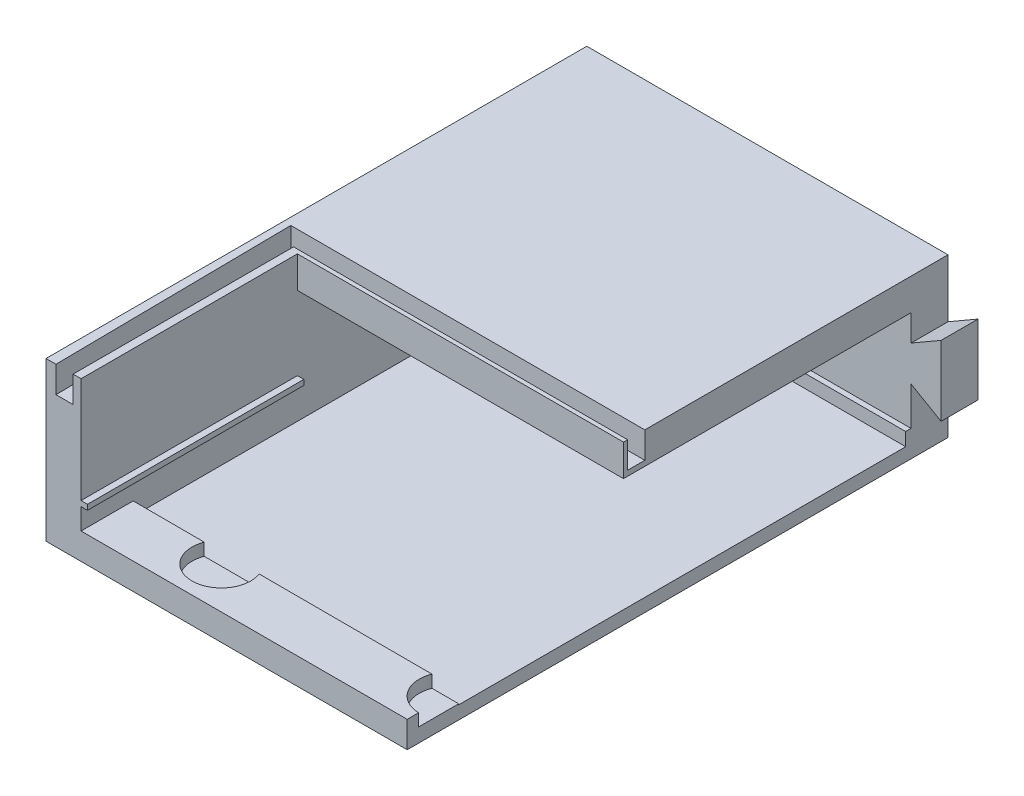
ISO-10303-21;
HEADER;
FILE_DESCRIPTION(('STEP AP214'),'2;1');
FILE_NAME('part.step','',(''),(''),'','','');
FILE_SCHEMA(('AUTOMOTIVE_DESIGN { 1 0 10303 214 1 1 1 1 }'));
ENDSEC;
DATA;
#1=APPLICATION_CONTEXT('core data for automotive mechanical design processes');
#2=APPLICATION_PROTOCOL_DEFINITION('international standard','automotive_design',2000,#1);
#3=PRODUCT_CONTEXT('',#1,'mechanical');
#4=PRODUCT('Part','Part','',(#3));
#5=PRODUCT_RELATED_PRODUCT_CATEGORY('part','',(#4));
#6=PRODUCT_DEFINITION_FORMATION('','',#4);
#7=PRODUCT_DEFINITION_CONTEXT('part definition',#1,'design');
#8=PRODUCT_DEFINITION('design','',#6,#7);
#9=PRODUCT_DEFINITION_SHAPE('','',#8);
#10=(LENGTH_UNIT() NAMED_UNIT(*) SI_UNIT(.MILLI.,.METRE.));
#11=(NAMED_UNIT(*) PLANE_ANGLE_UNIT() SI_UNIT($,.RADIAN.));
#12=(NAMED_UNIT(*) SI_UNIT($,.STERADIAN.) SOLID_ANGLE_UNIT());
#13=UNCERTAINTY_MEASURE_WITH_UNIT(LENGTH_MEASURE(1.E-05),#10,'distance_accuracy_value','');
#14=(GEOMETRIC_REPRESENTATION_CONTEXT(3) GLOBAL_UNCERTAINTY_ASSIGNED_CONTEXT((#13)) GLOBAL_UNIT_ASSIGNED_CONTEXT((#10,
#11,#12)) REPRESENTATION_CONTEXT('',''));
#15=CARTESIAN_POINT('',(0.,0.,0.));
#16=DIRECTION('',(0.,0.,1.));
#17=DIRECTION('',(1.,0.,0.));
#18=AXIS2_PLACEMENT_3D('',#15,#16,#17);
#19=CARTESIAN_POINT('',(-5.2976725084512,60.,90.));
#20=DIRECTION('',(-1.,0.,0.));
#21=DIRECTION('',(0.,0.,1.));
#22=AXIS2_PLACEMENT_3D('',#19,#20,#21);
#23=PLANE('',#22);
#24=DIRECTION('',(0.,0.,-1.));
#25=VECTOR('',#24,1.);
#26=CARTESIAN_POINT('',(-5.2976725084512,0.,90.));
#27=LINE('',#26,#25);
#28=CARTESIAN_POINT('',(-5.2976725084512,0.,90.));
#29=VERTEX_POINT('',#28);
#30=CARTESIAN_POINT('',(-5.2976725084512,0.,-115.));
#31=VERTEX_POINT('',#30);
#32=EDGE_CURVE('E303',#29,#31,#27,.T.);
#33=ORIENTED_EDGE('',*,*,#32,.F.);
#34=DIRECTION('',(0.,-1.,0.));
#35=VECTOR('',#34,1.);
#36=CARTESIAN_POINT('',(-5.2976725084512,60.,90.));
#37=LINE('',#36,#35);
#38=CARTESIAN_POINT('',(-5.2976725084512,60.,90.));
#39=VERTEX_POINT('',#38);
#40=EDGE_CURVE('E294',#39,#29,#37,.T.);
#41=ORIENTED_EDGE('',*,*,#40,.F.);
#42=DIRECTION('',(0.,0.,-1.));
#43=VECTOR('',#42,1.);
#44=CARTESIAN_POINT('',(-5.2976725084512,60.,90.));
#45=LINE('',#44,#43);
#46=CARTESIAN_POINT('',(-5.2976725084512,60.,-115.));
#47=VERTEX_POINT('',#46);
#48=EDGE_CURVE('E293',#39,#47,#45,.T.);
#49=ORIENTED_EDGE('',*,*,#48,.T.);
#50=DIRECTION('',(0.,-1.,0.));
#51=VECTOR('',#50,1.);
#52=CARTESIAN_POINT('',(-5.2976725084512,60.,-115.));
#53=LINE('',#52,#51);
#54=EDGE_CURVE('E816',#47,#31,#53,.T.);
#55=ORIENTED_EDGE('',*,*,#54,.T.);
#56=EDGE_LOOP('',(#33,#41,#49,#55));
#57=FACE_BOUND('',#56,.T.);
#58=ADVANCED_FACE('F45',(#57),#23,.T.);
#59=CARTESIAN_POINT('',(0.,0.,8.));
#60=DIRECTION('',(0.,0.,1.));
#61=DIRECTION('',(1.,0.,0.));
#62=AXIS2_PLACEMENT_3D('',#59,#60,#61);
#63=PLANE('',#62);
#64=DIRECTION('',(1.,0.,0.));
#65=VECTOR('',#64,1.);
#66=CARTESIAN_POINT('',(255.25,20.,8.));
#67=LINE('',#66,#65);
#68=CARTESIAN_POINT('',(8.00000000000001,20.,8.));
#69=VERTEX_POINT('',#68);
#70=CARTESIAN_POINT('',(10.4282385352864,20.,8.));
#71=VERTEX_POINT('',#70);
#72=EDGE_CURVE('E771',#69,#71,#67,.T.);
#73=ORIENTED_EDGE('',*,*,#72,.T.);
#74=DIRECTION('',(0.,-1.,0.));
#75=VECTOR('',#74,1.);
#76=CARTESIAN_POINT('',(10.4282385352864,9.99999999999999,8.));
#77=LINE('',#76,#75);
#78=CARTESIAN_POINT('',(10.4282385352864,18.,8.));
#79=VERTEX_POINT('',#78);
#80=EDGE_CURVE('E387',#71,#79,#77,.T.);
#81=ORIENTED_EDGE('',*,*,#80,.T.);
#82=DIRECTION('',(-1.,0.,0.));
#83=VECTOR('',#82,1.);
#84=CARTESIAN_POINT('',(255.25,18.,8.));
#85=LINE('',#84,#83);
#86=CARTESIAN_POINT('',(8.00000000000001,18.,8.));
#87=VERTEX_POINT('',#86);
#88=EDGE_CURVE('E88',#79,#87,#85,.T.);
#89=ORIENTED_EDGE('',*,*,#88,.T.);
#90=DIRECTION('',(0.,-1.,0.));
#91=VECTOR('',#90,1.);
#92=CARTESIAN_POINT('',(8.00000000000001,48.,8.));
#93=LINE('',#92,#91);
#94=EDGE_CURVE('E83',#69,#87,#93,.T.);
#95=ORIENTED_EDGE('',*,*,#94,.F.);
#96=EDGE_LOOP('',(#73,#81,#89,#95));
#97=FACE_BOUND('',#96,.T.);
#98=ADVANCED_FACE('F526',(#97),#63,.F.);
#99=CARTESIAN_POINT('',(131.857766280656,5.33999999999999,74.522104321755));
#100=DIRECTION('',(0.,1.,0.));
#101=DIRECTION('',(0.,0.,1.));
#102=AXIS2_PLACEMENT_3D('',#99,#100,#101);
#103=PLANE('',#102);
#104=CARTESIAN_POINT('',(131.857766280656,5.33999999999999,74.522104321755));
#105=DIRECTION('',(0.,1.,0.));
#106=DIRECTION('',(0.,0.,1.));
#107=AXIS2_PLACEMENT_3D('',#104,#105,#106);
#108=CIRCLE('',#107,11.15);
#109=CARTESIAN_POINT('',(121.471660690305,5.33999999999999,70.4660827899976));
#110=VERTEX_POINT('',#109);
#111=CARTESIAN_POINT('',(131.625,5.33999999999999,85.6696744542363));
#112=VERTEX_POINT('',#111);
#113=EDGE_CURVE('E335',#110,#112,#108,.T.);
#114=ORIENTED_EDGE('',*,*,#113,.T.);
#115=DIRECTION('',(0.,0.,-1.));
#116=VECTOR('',#115,1.);
#117=CARTESIAN_POINT('',(131.625,5.33999999999999,74.522104321755));
#118=LINE('',#117,#116);
#119=CARTESIAN_POINT('',(131.625,5.33999999999999,70.485148128343));
#120=VERTEX_POINT('',#119);
#121=EDGE_CURVE('E404',#112,#120,#118,.T.);
#122=ORIENTED_EDGE('',*,*,#121,.T.);
#123=DIRECTION('',(0.999998237049616,0.,0.00187773737807381));
#124=VECTOR('',#123,1.);
#125=CARTESIAN_POINT('',(131.86534579012,5.33999999999999,70.4855994354124));
#126=LINE('',#125,#124);
#127=EDGE_CURVE('E344',#110,#120,#126,.T.);
#128=ORIENTED_EDGE('',*,*,#127,.F.);
#129=EDGE_LOOP('',(#114,#122,#128));
#130=FACE_BOUND('',#129,.T.);
#131=ADVANCED_FACE('F484',(#130),#103,.T.);
#132=CARTESIAN_POINT('',(131.857766280656,5.33999999999999,74.522104321755));
#133=DIRECTION('',(0.,1.,0.));
#134=DIRECTION('',(0.,0.,1.));
#135=AXIS2_PLACEMENT_3D('',#132,#133,#134);
#136=CYLINDRICAL_SURFACE('',#135,11.15);
#137=DIRECTION('',(0.,1.,0.));
#138=VECTOR('',#137,1.);
#139=CARTESIAN_POINT('',(131.625,5.33999999999999,85.6696744542363));
#140=LINE('',#139,#138);
#141=CARTESIAN_POINT('',(131.625,9.99999999999999,85.6696744542363));
#142=VERTEX_POINT('',#141);
#143=EDGE_CURVE('E453',#112,#142,#140,.T.);
#144=ORIENTED_EDGE('',*,*,#143,.F.);
#145=ORIENTED_EDGE('',*,*,#113,.F.);
#146=DIRECTION('',(0.,1.,0.));
#147=VECTOR('',#146,1.);
#148=CARTESIAN_POINT('',(121.471660690305,5.33999999999999,70.4660827899976));
#149=LINE('',#148,#147);
#150=CARTESIAN_POINT('',(121.471660690305,9.99999999999999,70.4660827899976));
#151=VERTEX_POINT('',#150);
#152=EDGE_CURVE('E348',#110,#151,#149,.T.);
#153=ORIENTED_EDGE('',*,*,#152,.T.);
#154=CARTESIAN_POINT('',(131.857766280656,9.99999999999999,74.522104321755));
#155=DIRECTION('',(0.,1.,0.));
#156=DIRECTION('',(0.,0.,1.));
#157=AXIS2_PLACEMENT_3D('',#154,#155,#156);
#158=CIRCLE('',#157,11.15);
#159=EDGE_CURVE('E340',#151,#142,#158,.T.);
#160=ORIENTED_EDGE('',*,*,#159,.T.);
#161=EDGE_LOOP('',(#144,#145,#153,#160));
#162=FACE_BOUND('',#161,.T.);
#163=ADVANCED_FACE('F487',(#162),#136,.F.);
#164=CARTESIAN_POINT('',(45.4096313441434,5.33999999999999,74.2249257103475));
#165=DIRECTION('',(0.,1.,0.));
#166=DIRECTION('',(0.,0.,1.));
#167=AXIS2_PLACEMENT_3D('',#164,#165,#166);
#168=PLANE('',#167);
#169=DIRECTION('',(0.999998237049616,0.,0.00187773737807381));
#170=VECTOR('',#169,1.);
#171=CARTESIAN_POINT('',(45.4169576384815,5.33999999999999,70.3232717795302));
#172=LINE('',#171,#170);
#173=CARTESIAN_POINT('',(34.9719033899041,5.33999999999999,70.3036586761747));
#174=VERTEX_POINT('',#173);
#175=CARTESIAN_POINT('',(55.8620118870589,5.33999999999999,70.3428848828857));
#176=VERTEX_POINT('',#175);
#177=EDGE_CURVE('E760',#174,#176,#172,.T.);
#178=ORIENTED_EDGE('',*,*,#177,.F.);
#179=CARTESIAN_POINT('',(45.4096313441434,5.33999999999999,74.2249257103475));
#180=DIRECTION('',(0.,1.,0.));
#181=DIRECTION('',(0.,0.,1.));
#182=AXIS2_PLACEMENT_3D('',#179,#180,#181);
#183=CIRCLE('',#182,11.15);
#184=EDGE_CURVE('E744',#174,#176,#183,.T.);
#185=ORIENTED_EDGE('',*,*,#184,.T.);
#186=EDGE_LOOP('',(#178,#185));
#187=FACE_BOUND('',#186,.T.);
#188=ADVANCED_FACE('F558',(#187),#168,.T.);
#189=CARTESIAN_POINT('',(45.4096313441434,5.33999999999999,74.2249257103475));
#190=DIRECTION('',(0.,1.,0.));
#191=DIRECTION('',(0.,0.,1.));
#192=AXIS2_PLACEMENT_3D('',#189,#190,#191);
#193=CYLINDRICAL_SURFACE('',#192,11.15);
#194=CARTESIAN_POINT('',(45.4096313441434,9.99999999999999,74.2249257103475));
#195=DIRECTION('',(0.,1.,0.));
#196=DIRECTION('',(0.,0.,1.));
#197=AXIS2_PLACEMENT_3D('',#194,#195,#196);
#198=CIRCLE('',#197,11.15);
#199=CARTESIAN_POINT('',(34.9719033899041,9.99999999999999,70.3036586761747));
#200=VERTEX_POINT('',#199);
#201=CARTESIAN_POINT('',(55.8620118870589,9.99999999999999,70.3428848828857));
#202=VERTEX_POINT('',#201);
#203=EDGE_CURVE('E343',#200,#202,#198,.T.);
#204=ORIENTED_EDGE('',*,*,#203,.T.);
#205=DIRECTION('',(0.,1.,0.));
#206=VECTOR('',#205,1.);
#207=CARTESIAN_POINT('',(55.8620118870589,5.33999999999999,70.3428848828857));
#208=LINE('',#207,#206);
#209=EDGE_CURVE('E347',#202,#176,#208,.F.);
#210=ORIENTED_EDGE('',*,*,#209,.T.);
#211=ORIENTED_EDGE('',*,*,#184,.F.);
#212=DIRECTION('',(0.,1.,0.));
#213=VECTOR('',#212,1.);
#214=CARTESIAN_POINT('',(34.9719033899041,5.33999999999999,70.3036586761747));
#215=LINE('',#214,#213);
#216=EDGE_CURVE('E756',#174,#200,#215,.T.);
#217=ORIENTED_EDGE('',*,*,#216,.T.);
#218=EDGE_LOOP('',(#204,#210,#211,#217));
#219=FACE_BOUND('',#218,.T.);
#220=ADVANCED_FACE('F568',(#219),#193,.F.);
#221=CARTESIAN_POINT('',(255.25,9.99999999999999,8.));
#222=DIRECTION('',(0.,0.,-1.));
#223=DIRECTION('',(-1.,0.,0.));
#224=AXIS2_PLACEMENT_3D('',#221,#222,#223);
#225=PLANE('',#224);
#226=DIRECTION('',(0.,-1.,0.));
#227=VECTOR('',#226,1.);
#228=CARTESIAN_POINT('',(131.625,9.99999999999999,8.));
#229=LINE('',#228,#227);
#230=CARTESIAN_POINT('',(131.625,60.,8.));
#231=VERTEX_POINT('',#230);
#232=CARTESIAN_POINT('',(131.625,48.,8.));
#233=VERTEX_POINT('',#232);
#234=EDGE_CURVE('E260',#231,#233,#229,.T.);
#235=ORIENTED_EDGE('',*,*,#234,.F.);
#236=DIRECTION('',(-1.,0.,0.));
#237=VECTOR('',#236,1.);
#238=CARTESIAN_POINT('',(255.25,60.,8.));
#239=LINE('',#238,#237);
#240=CARTESIAN_POINT('',(8.,60.,8.));
#241=VERTEX_POINT('',#240);
#242=EDGE_CURVE('E332',#231,#241,#239,.T.);
#243=ORIENTED_EDGE('',*,*,#242,.T.);
#244=DIRECTION('',(0.,1.,0.));
#245=VECTOR('',#244,1.);
#246=CARTESIAN_POINT('',(8.,9.99999999999999,8.));
#247=LINE('',#246,#245);
#248=CARTESIAN_POINT('',(8.00000000000001,48.,8.));
#249=VERTEX_POINT('',#248);
#250=EDGE_CURVE('E263',#249,#241,#247,.T.);
#251=ORIENTED_EDGE('',*,*,#250,.F.);
#252=DIRECTION('',(-1.,0.,0.));
#253=VECTOR('',#252,1.);
#254=CARTESIAN_POINT('',(255.25,48.,8.));
#255=LINE('',#254,#253);
#256=EDGE_CURVE('E49',#233,#249,#255,.T.);
#257=ORIENTED_EDGE('',*,*,#256,.F.);
#258=EDGE_LOOP('',(#235,#243,#251,#257));
#259=FACE_BOUND('',#258,.T.);
#260=ADVANCED_FACE('F259',(#259),#225,.F.);
#261=CARTESIAN_POINT('',(8.,4.99999999999999,70.2530124357349));
#262=DIRECTION('',(-0.00187773737807381,0.,0.999998237049616));
#263=DIRECTION('',(0.999998237049616,0.,0.00187773737807381));
#264=AXIS2_PLACEMENT_3D('',#261,#262,#263);
#265=PLANE('',#264);
#266=DIRECTION('',(0.,1.,0.));
#267=VECTOR('',#266,1.);
#268=CARTESIAN_POINT('',(131.625,5.00000000000111,70.4851481283429));
#269=LINE('',#268,#267);
#270=CARTESIAN_POINT('',(131.625,4.99999999999999,70.4851481283429));
#271=VERTEX_POINT('',#270);
#272=EDGE_CURVE('E457',#271,#120,#269,.T.);
#273=ORIENTED_EDGE('',*,*,#272,.F.);
#274=DIRECTION('',(0.999998237049615,0.,0.00187773737807381));
#275=VECTOR('',#274,1.);
#276=CARTESIAN_POINT('',(8.,4.99999999999999,70.2530124357349));
#277=LINE('',#276,#275);
#278=CARTESIAN_POINT('',(8.,4.99999999999999,70.2530124357349));
#279=VERTEX_POINT('',#278);
#280=EDGE_CURVE('E352',#279,#271,#277,.T.);
#281=ORIENTED_EDGE('',*,*,#280,.F.);
#282=DIRECTION('',(0.,1.,0.));
#283=VECTOR('',#282,1.);
#284=CARTESIAN_POINT('',(8.,4.99999999999999,70.2530124357349));
#285=LINE('',#284,#283);
#286=CARTESIAN_POINT('',(8.,9.99999999999999,70.2530124357349));
#287=VERTEX_POINT('',#286);
#288=EDGE_CURVE('E763',#279,#287,#285,.T.);
#289=ORIENTED_EDGE('',*,*,#288,.T.);
#290=DIRECTION('',(0.999998237049615,0.,0.00187773737807381));
#291=VECTOR('',#290,1.);
#292=CARTESIAN_POINT('',(8.,9.99999999999999,70.2530124357349));
#293=LINE('',#292,#291);
#294=EDGE_CURVE('E359',#287,#200,#293,.T.);
#295=ORIENTED_EDGE('',*,*,#294,.T.);
#296=ORIENTED_EDGE('',*,*,#216,.F.);
#297=ORIENTED_EDGE('',*,*,#177,.T.);
#298=ORIENTED_EDGE('',*,*,#209,.F.);
#299=EDGE_CURVE('E362',#202,#151,#293,.T.);
#300=ORIENTED_EDGE('',*,*,#299,.T.);
#301=ORIENTED_EDGE('',*,*,#152,.F.);
#302=ORIENTED_EDGE('',*,*,#127,.T.);
#303=EDGE_LOOP('',(#273,#281,#289,#295,#296,#297,#298,#300,#301,#302));
#304=FACE_BOUND('',#303,.T.);
#305=ADVANCED_FACE('F479',(#304),#265,.F.);
#306=CARTESIAN_POINT('',(4.98139206480159,50.,6.43875543881975));
#307=DIRECTION('',(0.,0.,1.));
#308=DIRECTION('',(1.,0.,0.));
#309=AXIS2_PLACEMENT_3D('',#306,#307,#308);
#310=PLANE('',#309);
#311=DIRECTION('',(0.,1.,0.));
#312=VECTOR('',#311,1.);
#313=CARTESIAN_POINT('',(131.625,50.,6.43875543881975));
#314=LINE('',#313,#312);
#315=CARTESIAN_POINT('',(131.625,50.,6.43875543881975));
#316=VERTEX_POINT('',#315);
#317=CARTESIAN_POINT('',(131.625,60.,6.43875543881975));
#318=VERTEX_POINT('',#317);
#319=EDGE_CURVE('E450',#316,#318,#314,.T.);
#320=ORIENTED_EDGE('',*,*,#319,.F.);
#321=DIRECTION('',(1.,0.,0.));
#322=VECTOR('',#321,1.);
#323=CARTESIAN_POINT('',(4.98139206480159,50.,6.43875543881975));
#324=LINE('',#323,#322);
#325=CARTESIAN_POINT('',(4.98139206480159,50.,6.43875543881975));
#326=VERTEX_POINT('',#325);
#327=EDGE_CURVE('E308',#326,#316,#324,.T.);
#328=ORIENTED_EDGE('',*,*,#327,.F.);
#329=DIRECTION('',(0.,1.,0.));
#330=VECTOR('',#329,1.);
#331=CARTESIAN_POINT('',(4.98139206480159,50.,6.43875543881975));
#332=LINE('',#331,#330);
#333=CARTESIAN_POINT('',(4.98139206480159,60.,6.43875543881975));
#334=VERTEX_POINT('',#333);
#335=EDGE_CURVE('E307',#326,#334,#332,.T.);
#336=ORIENTED_EDGE('',*,*,#335,.T.);
#337=DIRECTION('',(1.,0.,0.));
#338=VECTOR('',#337,1.);
#339=CARTESIAN_POINT('',(4.98139206480159,60.,6.43875543881975));
#340=LINE('',#339,#338);
#341=EDGE_CURVE('E318',#334,#318,#340,.T.);
#342=ORIENTED_EDGE('',*,*,#341,.T.);
#343=EDGE_LOOP('',(#320,#328,#336,#342));
#344=FACE_BOUND('',#343,.T.);
#345=ADVANCED_FACE('F550',(#344),#310,.F.);
#346=CARTESIAN_POINT('',(-2.56783199264043,50.,-0.0612445611802538));
#347=DIRECTION('',(0.,0.,1.));
#348=DIRECTION('',(1.,0.,0.));
#349=AXIS2_PLACEMENT_3D('',#346,#347,#348);
#350=PLANE('',#349);
#351=DIRECTION('',(1.,0.,0.));
#352=VECTOR('',#351,1.);
#353=CARTESIAN_POINT('',(-2.56783199264043,50.,-0.0612445611802538));
#354=LINE('',#353,#352);
#355=CARTESIAN_POINT('',(-2.56783199264043,50.,-0.0612445611802538));
#356=VERTEX_POINT('',#355);
#357=CARTESIAN_POINT('',(131.625,50.,-0.0612445611802554));
#358=VERTEX_POINT('',#357);
#359=EDGE_CURVE('E312',#356,#358,#354,.T.);
#360=ORIENTED_EDGE('',*,*,#359,.T.);
#361=DIRECTION('',(0.,1.,0.));
#362=VECTOR('',#361,1.);
#363=CARTESIAN_POINT('',(131.625,50.,-0.0612445611802554));
#364=LINE('',#363,#362);
#365=CARTESIAN_POINT('',(131.625,60.,-0.0612445611802554));
#366=VERTEX_POINT('',#365);
#367=EDGE_CURVE('E415',#358,#366,#364,.T.);
#368=ORIENTED_EDGE('',*,*,#367,.T.);
#369=DIRECTION('',(1.,0.,0.));
#370=VECTOR('',#369,1.);
#371=CARTESIAN_POINT('',(-2.56783199264043,60.,-0.0612445611802538));
#372=LINE('',#371,#370);
#373=CARTESIAN_POINT('',(-2.56783199264043,60.,-0.0612445611802538));
#374=VERTEX_POINT('',#373);
#375=EDGE_CURVE('E321',#374,#366,#372,.T.);
#376=ORIENTED_EDGE('',*,*,#375,.F.);
#377=DIRECTION('',(0.,1.,0.));
#378=VECTOR('',#377,1.);
#379=CARTESIAN_POINT('',(-2.56783199264043,50.,-0.0612445611802538));
#380=LINE('',#379,#378);
#381=EDGE_CURVE('E718',#356,#374,#380,.T.);
#382=ORIENTED_EDGE('',*,*,#381,.F.);
#383=EDGE_LOOP('',(#360,#368,#376,#382));
#384=FACE_BOUND('',#383,.T.);
#385=ADVANCED_FACE('F547',(#384),#350,.T.);
#386=CARTESIAN_POINT('',(0.,60.,0.));
#387=DIRECTION('',(0.,-1.,0.));
#388=DIRECTION('',(0.,0.,-1.));
#389=AXIS2_PLACEMENT_3D('',#386,#387,#388);
#390=PLANE('',#389);
#391=DIRECTION('',(0.,0.,1.));
#392=VECTOR('',#391,1.);
#393=CARTESIAN_POINT('',(131.625,60.,0.));
#394=LINE('',#393,#392);
#395=CARTESIAN_POINT('',(131.625,60.,-115.));
#396=VERTEX_POINT('',#395);
#397=EDGE_CURVE('E446',#396,#366,#394,.T.);
#398=ORIENTED_EDGE('',*,*,#397,.F.);
#399=DIRECTION('',(1.,0.,0.));
#400=VECTOR('',#399,1.);
#401=CARTESIAN_POINT('',(-5.2976725084512,60.,-115.));
#402=LINE('',#401,#400);
#403=EDGE_CURVE('E290',#47,#396,#402,.T.);
#404=ORIENTED_EDGE('',*,*,#403,.F.);
#405=ORIENTED_EDGE('',*,*,#48,.F.);
#406=DIRECTION('',(-1.,0.,0.));
#407=VECTOR('',#406,1.);
#408=CARTESIAN_POINT('',(268.719836563698,60.,90.));
#409=LINE('',#408,#407);
#410=CARTESIAN_POINT('',(-1.5186079351983,60.,90.000001141251));
#411=VERTEX_POINT('',#410);
#412=EDGE_CURVE('E298',#411,#39,#409,.T.);
#413=ORIENTED_EDGE('',*,*,#412,.F.);
#414=DIRECTION('',(-0.011649326560156,0.,-0.999932144293149));
#415=VECTOR('',#414,1.);
#416=CARTESIAN_POINT('',(-1.5186079351983,60.,90.000001141251));
#417=LINE('',#416,#415);
#418=EDGE_CURVE('E317',#411,#374,#417,.T.);
#419=ORIENTED_EDGE('',*,*,#418,.T.);
#420=ORIENTED_EDGE('',*,*,#375,.T.);
#421=EDGE_LOOP('',(#398,#404,#405,#413,#419,#420));
#422=FACE_BOUND('',#421,.T.);
#423=ADVANCED_FACE('F546',(#422),#390,.F.);
#424=CARTESIAN_POINT('',(-1.5186079351983,50.,90.000001141251));
#425=DIRECTION('',(0.999932144293149,0.,-0.011649326560156));
#426=DIRECTION('',(-0.011649326560156,0.,-0.999932144293149));
#427=AXIS2_PLACEMENT_3D('',#424,#425,#426);
#428=PLANE('',#427);
#429=ORIENTED_EDGE('',*,*,#418,.F.);
#430=DIRECTION('',(0.,1.,0.));
#431=VECTOR('',#430,1.);
#432=CARTESIAN_POINT('',(-1.5186079351983,50.,90.000001141251));
#433=LINE('',#432,#431);
#434=CARTESIAN_POINT('',(-1.5186079351983,50.,90.000001141251));
#435=VERTEX_POINT('',#434);
#436=EDGE_CURVE('E710',#435,#411,#433,.T.);
#437=ORIENTED_EDGE('',*,*,#436,.F.);
#438=DIRECTION('',(-0.011649326560156,0.,-0.999932144293149));
#439=VECTOR('',#438,1.);
#440=CARTESIAN_POINT('',(-1.5186079351983,50.,90.000001141251));
#441=LINE('',#440,#439);
#442=EDGE_CURVE('E722',#435,#356,#441,.T.);
#443=ORIENTED_EDGE('',*,*,#442,.T.);
#444=ORIENTED_EDGE('',*,*,#381,.T.);
#445=EDGE_LOOP('',(#429,#437,#443,#444));
#446=FACE_BOUND('',#445,.T.);
#447=ADVANCED_FACE('F581',(#446),#428,.T.);
#448=CARTESIAN_POINT('',(0.,50.,0.));
#449=DIRECTION('',(0.,1.,0.));
#450=DIRECTION('',(0.,0.,1.));
#451=AXIS2_PLACEMENT_3D('',#448,#449,#450);
#452=PLANE('',#451);
#453=ORIENTED_EDGE('',*,*,#327,.T.);
#454=DIRECTION('',(0.,0.,-1.));
#455=VECTOR('',#454,1.);
#456=CARTESIAN_POINT('',(131.625,50.,0.));
#457=LINE('',#456,#455);
#458=EDGE_CURVE('E412',#316,#358,#457,.T.);
#459=ORIENTED_EDGE('',*,*,#458,.T.);
#460=ORIENTED_EDGE('',*,*,#359,.F.);
#461=ORIENTED_EDGE('',*,*,#442,.F.);
#462=DIRECTION('',(0.999999999999985,0.,-1.75577074247057E-07));
#463=VECTOR('',#462,1.);
#464=CARTESIAN_POINT('',(-1.5186079351983,50.,90.000001141251));
#465=LINE('',#464,#463);
#466=CARTESIAN_POINT('',(4.9813920648016,50.,90.));
#467=VERTEX_POINT('',#466);
#468=EDGE_CURVE('E728',#435,#467,#465,.T.);
#469=ORIENTED_EDGE('',*,*,#468,.T.);
#470=DIRECTION('',(0.,0.,1.));
#471=VECTOR('',#470,1.);
#472=CARTESIAN_POINT('',(4.98139206480159,50.,6.43875543881975));
#473=LINE('',#472,#471);
#474=EDGE_CURVE('E313',#326,#467,#473,.T.);
#475=ORIENTED_EDGE('',*,*,#474,.F.);
#476=EDGE_LOOP('',(#453,#459,#460,#461,#469,#475));
#477=FACE_BOUND('',#476,.T.);
#478=ADVANCED_FACE('F579',(#477),#452,.T.);
#479=CARTESIAN_POINT('',(4.98139206480159,50.,6.43875543881975));
#480=DIRECTION('',(-1.,0.,0.));
#481=DIRECTION('',(0.,0.,1.));
#482=AXIS2_PLACEMENT_3D('',#479,#480,#481);
#483=PLANE('',#482);
#484=DIRECTION('',(0.,0.,1.));
#485=VECTOR('',#484,1.);
#486=CARTESIAN_POINT('',(4.98139206480159,60.,6.43875543881975));
#487=LINE('',#486,#485);
#488=CARTESIAN_POINT('',(4.9813920648016,60.,90.));
#489=VERTEX_POINT('',#488);
#490=EDGE_CURVE('E322',#334,#489,#487,.T.);
#491=ORIENTED_EDGE('',*,*,#490,.F.);
#492=ORIENTED_EDGE('',*,*,#335,.F.);
#493=ORIENTED_EDGE('',*,*,#474,.T.);
#494=DIRECTION('',(0.,1.,0.));
#495=VECTOR('',#494,1.);
#496=CARTESIAN_POINT('',(4.9813920648016,50.,90.));
#497=LINE('',#496,#495);
#498=EDGE_CURVE('E701',#467,#489,#497,.T.);
#499=ORIENTED_EDGE('',*,*,#498,.T.);
#500=EDGE_LOOP('',(#491,#492,#493,#499));
#501=FACE_BOUND('',#500,.T.);
#502=ADVANCED_FACE('F544',(#501),#483,.T.);
#503=DIRECTION('',(0.,0.,1.));
#504=VECTOR('',#503,1.);
#505=CARTESIAN_POINT('',(131.625,60.,0.));
#506=LINE('',#505,#504);
#507=EDGE_CURVE('E275',#318,#231,#506,.T.);
#508=ORIENTED_EDGE('',*,*,#507,.F.);
#509=ORIENTED_EDGE('',*,*,#341,.F.);
#510=ORIENTED_EDGE('',*,*,#490,.T.);
#511=CARTESIAN_POINT('',(8.00000000000001,60.,90.));
#512=VERTEX_POINT('',#511);
#513=EDGE_CURVE('E295',#512,#489,#409,.T.);
#514=ORIENTED_EDGE('',*,*,#513,.F.);
#515=DIRECTION('',(0.,0.,1.));
#516=VECTOR('',#515,1.);
#517=CARTESIAN_POINT('',(8.,60.,8.));
#518=LINE('',#517,#516);
#519=EDGE_CURVE('E336',#241,#512,#518,.T.);
#520=ORIENTED_EDGE('',*,*,#519,.F.);
#521=ORIENTED_EDGE('',*,*,#242,.F.);
#522=EDGE_LOOP('',(#508,#509,#510,#514,#520,#521));
#523=FACE_BOUND('',#522,.T.);
#524=ADVANCED_FACE('F540',(#523),#390,.F.);
#525=CARTESIAN_POINT('',(7.99999999999999,20.,4.99999999999999));
#526=DIRECTION('',(0.,1.,0.));
#527=DIRECTION('',(0.,0.,1.));
#528=AXIS2_PLACEMENT_3D('',#525,#526,#527);
#529=PLANE('',#528);
#530=ORIENTED_EDGE('',*,*,#72,.F.);
#531=DIRECTION('',(0.,0.,-1.));
#532=VECTOR('',#531,1.);
#533=CARTESIAN_POINT('',(8.,20.,8.));
#534=LINE('',#533,#532);
#535=CARTESIAN_POINT('',(8.00000000000001,20.,90.));
#536=VERTEX_POINT('',#535);
#537=EDGE_CURVE('E808',#536,#69,#534,.T.);
#538=ORIENTED_EDGE('',*,*,#537,.F.);
#539=DIRECTION('',(-1.,0.,0.));
#540=VECTOR('',#539,1.);
#541=CARTESIAN_POINT('',(7.99999999999999,20.,90.));
#542=LINE('',#541,#540);
#543=CARTESIAN_POINT('',(10.4282385352864,20.,90.));
#544=VERTEX_POINT('',#543);
#545=EDGE_CURVE('E780',#544,#536,#542,.T.);
#546=ORIENTED_EDGE('',*,*,#545,.F.);
#547=DIRECTION('',(0.,0.,1.));
#548=VECTOR('',#547,1.);
#549=CARTESIAN_POINT('',(10.4282385352864,20.,4.99999999999999));
#550=LINE('',#549,#548);
#551=EDGE_CURVE('E776',#71,#544,#550,.T.);
#552=ORIENTED_EDGE('',*,*,#551,.F.);
#553=EDGE_LOOP('',(#530,#538,#546,#552));
#554=FACE_BOUND('',#553,.T.);
#555=ADVANCED_FACE('F543',(#554),#529,.T.);
#556=CARTESIAN_POINT('',(10.4282385352864,20.,4.99999999999999));
#557=DIRECTION('',(1.,0.,0.));
#558=DIRECTION('',(0.,0.,-1.));
#559=AXIS2_PLACEMENT_3D('',#556,#557,#558);
#560=PLANE('',#559);
#561=ORIENTED_EDGE('',*,*,#80,.F.);
#562=ORIENTED_EDGE('',*,*,#551,.T.);
#563=DIRECTION('',(0.,1.,0.));
#564=VECTOR('',#563,1.);
#565=CARTESIAN_POINT('',(10.4282385352864,20.,90.));
#566=LINE('',#565,#564);
#567=CARTESIAN_POINT('',(10.4282385352864,18.,90.));
#568=VERTEX_POINT('',#567);
#569=EDGE_CURVE('E785',#568,#544,#566,.T.);
#570=ORIENTED_EDGE('',*,*,#569,.F.);
#571=DIRECTION('',(0.,0.,1.));
#572=VECTOR('',#571,1.);
#573=CARTESIAN_POINT('',(10.4282385352864,18.,4.99999999999999));
#574=LINE('',#573,#572);
#575=EDGE_CURVE('E777',#79,#568,#574,.T.);
#576=ORIENTED_EDGE('',*,*,#575,.F.);
#577=EDGE_LOOP('',(#561,#562,#570,#576));
#578=FACE_BOUND('',#577,.T.);
#579=ADVANCED_FACE('F668',(#578),#560,.T.);
#580=CARTESIAN_POINT('',(10.4282385352864,18.,4.99999999999999));
#581=DIRECTION('',(0.,-1.,0.));
#582=DIRECTION('',(0.,0.,-1.));
#583=AXIS2_PLACEMENT_3D('',#580,#581,#582);
#584=PLANE('',#583);
#585=ORIENTED_EDGE('',*,*,#88,.F.);
#586=ORIENTED_EDGE('',*,*,#575,.T.);
#587=DIRECTION('',(1.,0.,0.));
#588=VECTOR('',#587,1.);
#589=CARTESIAN_POINT('',(10.4282385352864,18.,90.));
#590=LINE('',#589,#588);
#591=CARTESIAN_POINT('',(7.99999999999999,18.,90.));
#592=VERTEX_POINT('',#591);
#593=EDGE_CURVE('E789',#592,#568,#590,.T.);
#594=ORIENTED_EDGE('',*,*,#593,.F.);
#595=DIRECTION('',(0.,0.,1.));
#596=VECTOR('',#595,1.);
#597=CARTESIAN_POINT('',(8.,18.,8.));
#598=LINE('',#597,#596);
#599=EDGE_CURVE('E812',#87,#592,#598,.T.);
#600=ORIENTED_EDGE('',*,*,#599,.F.);
#601=EDGE_LOOP('',(#585,#586,#594,#600));
#602=FACE_BOUND('',#601,.T.);
#603=ADVANCED_FACE('F672',(#602),#584,.T.);
#604=CARTESIAN_POINT('',(8.,9.99999999999999,8.));
#605=DIRECTION('',(-1.,0.,0.));
#606=DIRECTION('',(0.,0.,1.));
#607=AXIS2_PLACEMENT_3D('',#604,#605,#606);
#608=PLANE('',#607);
#609=ORIENTED_EDGE('',*,*,#94,.T.);
#610=ORIENTED_EDGE('',*,*,#599,.T.);
#611=DIRECTION('',(0.,1.,0.));
#612=VECTOR('',#611,1.);
#613=CARTESIAN_POINT('',(8.00000000000001,9.99999999999999,90.));
#614=LINE('',#613,#612);
#615=CARTESIAN_POINT('',(8.00000000000001,9.99999999999999,90.));
#616=VERTEX_POINT('',#615);
#617=EDGE_CURVE('E326',#616,#592,#614,.T.);
#618=ORIENTED_EDGE('',*,*,#617,.F.);
#619=DIRECTION('',(0.,0.,1.));
#620=VECTOR('',#619,1.);
#621=CARTESIAN_POINT('',(8.,9.99999999999999,8.));
#622=LINE('',#621,#620);
#623=EDGE_CURVE('E331',#287,#616,#622,.T.);
#624=ORIENTED_EDGE('',*,*,#623,.F.);
#625=ORIENTED_EDGE('',*,*,#288,.F.);
#626=DIRECTION('',(0.,0.,1.));
#627=VECTOR('',#626,1.);
#628=CARTESIAN_POINT('',(8.,4.99999999999999,70.2530124357349));
#629=LINE('',#628,#627);
#630=CARTESIAN_POINT('',(8.,4.99999999999999,-98.9628021729257));
#631=VERTEX_POINT('',#630);
#632=EDGE_CURVE('E353',#631,#279,#629,.T.);
#633=ORIENTED_EDGE('',*,*,#632,.F.);
#634=DIRECTION('',(0.,1.,0.));
#635=VECTOR('',#634,1.);
#636=CARTESIAN_POINT('',(8.,4.99999999999999,-98.9628021729257));
#637=LINE('',#636,#635);
#638=CARTESIAN_POINT('',(8.00000000000001,9.99999999999999,-98.9628021729257));
#639=VERTEX_POINT('',#638);
#640=EDGE_CURVE('E764',#631,#639,#637,.T.);
#641=ORIENTED_EDGE('',*,*,#640,.T.);
#642=DIRECTION('',(0.,0.,1.));
#643=VECTOR('',#642,1.);
#644=CARTESIAN_POINT('',(8.00000000000001,9.99999999999999,-101.));
#645=LINE('',#644,#643);
#646=CARTESIAN_POINT('',(8.00000000000001,9.99999999999999,-101.));
#647=VERTEX_POINT('',#646);
#648=EDGE_CURVE('E75',#647,#639,#645,.T.);
#649=ORIENTED_EDGE('',*,*,#648,.F.);
#650=DIRECTION('',(0.,-1.,0.));
#651=VECTOR('',#650,1.);
#652=CARTESIAN_POINT('',(8.00000000000001,48.,-101.));
#653=LINE('',#652,#651);
#654=CARTESIAN_POINT('',(8.00000000000001,48.,-101.));
#655=VERTEX_POINT('',#654);
#656=EDGE_CURVE('E366',#655,#647,#653,.T.);
#657=ORIENTED_EDGE('',*,*,#656,.F.);
#658=DIRECTION('',(0.,0.,1.));
#659=VECTOR('',#658,1.);
#660=CARTESIAN_POINT('',(8.00000000000001,48.,-101.));
#661=LINE('',#660,#659);
#662=EDGE_CURVE('E367',#655,#249,#661,.T.);
#663=ORIENTED_EDGE('',*,*,#662,.T.);
#664=ORIENTED_EDGE('',*,*,#250,.T.);
#665=ORIENTED_EDGE('',*,*,#519,.T.);
#666=EDGE_CURVE('E736',#536,#512,#614,.T.);
#667=ORIENTED_EDGE('',*,*,#666,.F.);
#668=ORIENTED_EDGE('',*,*,#537,.T.);
#669=EDGE_LOOP('',(#609,#610,#618,#624,#625,#633,#641,#649,#657,#663,#664,#665,#667,#668));
#670=FACE_BOUND('',#669,.T.);
#671=ADVANCED_FACE('F556',(#670),#608,.F.);
#672=CARTESIAN_POINT('',(0.,9.99999999999999,0.));
#673=DIRECTION('',(0.,1.,0.));
#674=DIRECTION('',(0.,0.,1.));
#675=AXIS2_PLACEMENT_3D('',#672,#673,#674);
#676=PLANE('',#675);
#677=DIRECTION('',(1.,0.,0.));
#678=VECTOR('',#677,1.);
#679=CARTESIAN_POINT('',(8.00000000000001,9.99999999999999,90.));
#680=LINE('',#679,#678);
#681=CARTESIAN_POINT('',(131.625,9.99999999999999,90.));
#682=VERTEX_POINT('',#681);
#683=EDGE_CURVE('E327',#616,#682,#680,.T.);
#684=ORIENTED_EDGE('',*,*,#683,.T.);
#685=DIRECTION('',(0.,0.,-1.));
#686=VECTOR('',#685,1.);
#687=CARTESIAN_POINT('',(131.625,9.99999999999999,0.));
#688=LINE('',#687,#686);
#689=EDGE_CURVE('E408',#682,#142,#688,.T.);
#690=ORIENTED_EDGE('',*,*,#689,.T.);
#691=ORIENTED_EDGE('',*,*,#159,.F.);
#692=ORIENTED_EDGE('',*,*,#299,.F.);
#693=ORIENTED_EDGE('',*,*,#203,.F.);
#694=ORIENTED_EDGE('',*,*,#294,.F.);
#695=ORIENTED_EDGE('',*,*,#623,.T.);
#696=EDGE_LOOP('',(#684,#690,#691,#692,#693,#694,#695));
#697=FACE_BOUND('',#696,.T.);
#698=ADVANCED_FACE('F491',(#697),#676,.T.);
#699=CARTESIAN_POINT('',(0.,60.,90.));
#700=DIRECTION('',(0.,0.,1.));
#701=DIRECTION('',(1.,0.,0.));
#702=AXIS2_PLACEMENT_3D('',#699,#700,#701);
#703=PLANE('',#702);
#704=DIRECTION('',(-1.,0.,0.));
#705=VECTOR('',#704,1.);
#706=CARTESIAN_POINT('',(0.,0.,90.));
#707=LINE('',#706,#705);
#708=CARTESIAN_POINT('',(131.625,0.,90.));
#709=VERTEX_POINT('',#708);
#710=EDGE_CURVE('E304',#709,#29,#707,.T.);
#711=ORIENTED_EDGE('',*,*,#710,.F.);
#712=DIRECTION('',(0.,1.,0.));
#713=VECTOR('',#712,1.);
#714=CARTESIAN_POINT('',(131.624999999999,60.0000000000012,90.));
#715=LINE('',#714,#713);
#716=EDGE_CURVE('E277',#709,#682,#715,.T.);
#717=ORIENTED_EDGE('',*,*,#716,.T.);
#718=ORIENTED_EDGE('',*,*,#683,.F.);
#719=ORIENTED_EDGE('',*,*,#617,.T.);
#720=ORIENTED_EDGE('',*,*,#593,.T.);
#721=ORIENTED_EDGE('',*,*,#569,.T.);
#722=ORIENTED_EDGE('',*,*,#545,.T.);
#723=ORIENTED_EDGE('',*,*,#666,.T.);
#724=ORIENTED_EDGE('',*,*,#513,.T.);
#725=ORIENTED_EDGE('',*,*,#498,.F.);
#726=ORIENTED_EDGE('',*,*,#468,.F.);
#727=ORIENTED_EDGE('',*,*,#436,.T.);
#728=ORIENTED_EDGE('',*,*,#412,.T.);
#729=ORIENTED_EDGE('',*,*,#40,.T.);
#730=EDGE_LOOP('',(#711,#717,#718,#719,#720,#721,#722,#723,#724,#725,#726,#727,#728,#729));
#731=FACE_BOUND('',#730,.T.);
#732=ADVANCED_FACE('F496',(#731),#703,.T.);
#733=CARTESIAN_POINT('',(-5.2976725084512,60.,-115.));
#734=DIRECTION('',(0.,0.,-1.));
#735=DIRECTION('',(-1.,0.,0.));
#736=AXIS2_PLACEMENT_3D('',#733,#734,#735);
#737=PLANE('',#736);
#738=DIRECTION('',(-0.866025403784441,0.499999999999997,0.));
#739=VECTOR('',#738,1.);
#740=CARTESIAN_POINT('',(13.5955342663267,92.7239940518201,-115.));
#741=LINE('',#740,#739);
#742=CARTESIAN_POINT('',(142.996381437181,18.0143801043625,-115.));
#743=VERTEX_POINT('',#742);
#744=CARTESIAN_POINT('',(131.625,24.5796502381768,-115.));
#745=VERTEX_POINT('',#744);
#746=EDGE_CURVE('E433',#743,#745,#741,.T.);
#747=ORIENTED_EDGE('',*,*,#746,.T.);
#748=DIRECTION('',(0.,-1.,0.));
#749=VECTOR('',#748,1.);
#750=CARTESIAN_POINT('',(131.624999999999,60.0000000000012,-115.));
#751=LINE('',#750,#749);
#752=CARTESIAN_POINT('',(131.625,0.,-115.));
#753=VERTEX_POINT('',#752);
#754=EDGE_CURVE('E437',#745,#753,#751,.T.);
#755=ORIENTED_EDGE('',*,*,#754,.T.);
#756=DIRECTION('',(1.,0.,0.));
#757=VECTOR('',#756,1.);
#758=CARTESIAN_POINT('',(-5.2976725084512,0.,-115.));
#759=LINE('',#758,#757);
#760=EDGE_CURVE('E299',#31,#753,#759,.T.);
#761=ORIENTED_EDGE('',*,*,#760,.F.);
#762=ORIENTED_EDGE('',*,*,#54,.F.);
#763=ORIENTED_EDGE('',*,*,#403,.T.);
#764=DIRECTION('',(0.,-1.,0.));
#765=VECTOR('',#764,1.);
#766=CARTESIAN_POINT('',(131.625,60.,-115.));
#767=LINE('',#766,#765);
#768=CARTESIAN_POINT('',(131.625,38.0210152059206,-115.));
#769=VERTEX_POINT('',#768);
#770=EDGE_CURVE('E421',#396,#769,#767,.T.);
#771=ORIENTED_EDGE('',*,*,#770,.T.);
#772=DIRECTION('',(0.86602540378444,0.499999999999997,0.));
#773=VECTOR('',#772,1.);
#774=CARTESIAN_POINT('',(38.4501752091935,-15.7734949687474,-115.));
#775=LINE('',#774,#773);
#776=CARTESIAN_POINT('',(142.996381437181,44.5862853397348,-115.));
#777=VERTEX_POINT('',#776);
#778=EDGE_CURVE('E425',#769,#777,#775,.T.);
#779=ORIENTED_EDGE('',*,*,#778,.T.);
#780=DIRECTION('',(0.,-1.,0.));
#781=VECTOR('',#780,1.);
#782=CARTESIAN_POINT('',(142.996381437181,60.,-115.));
#783=LINE('',#782,#781);
#784=EDGE_CURVE('E429',#777,#743,#783,.T.);
#785=ORIENTED_EDGE('',*,*,#784,.T.);
#786=EDGE_LOOP('',(#747,#755,#761,#762,#763,#771,#779,#785));
#787=FACE_BOUND('',#786,.T.);
#788=ADVANCED_FACE('F505',(#787),#737,.T.);
#789=CARTESIAN_POINT('',(0.,0.,0.));
#790=DIRECTION('',(0.,-1.,0.));
#791=DIRECTION('',(0.,0.,-1.));
#792=AXIS2_PLACEMENT_3D('',#789,#790,#791);
#793=PLANE('',#792);
#794=ORIENTED_EDGE('',*,*,#760,.T.);
#795=DIRECTION('',(0.,0.,1.));
#796=VECTOR('',#795,1.);
#797=CARTESIAN_POINT('',(131.625,0.,0.));
#798=LINE('',#797,#796);
#799=EDGE_CURVE('E418',#753,#709,#798,.T.);
#800=ORIENTED_EDGE('',*,*,#799,.T.);
#801=ORIENTED_EDGE('',*,*,#710,.T.);
#802=ORIENTED_EDGE('',*,*,#32,.T.);
#803=EDGE_LOOP('',(#794,#800,#801,#802));
#804=FACE_BOUND('',#803,.T.);
#805=ADVANCED_FACE('F47',(#804),#793,.T.);
#806=CARTESIAN_POINT('',(8.,4.99999999999999,-98.9628021729257));
#807=DIRECTION('',(0.,0.,-1.));
#808=DIRECTION('',(-1.,0.,0.));
#809=AXIS2_PLACEMENT_3D('',#806,#807,#808);
#810=PLANE('',#809);
#811=DIRECTION('',(0.,-1.,0.));
#812=VECTOR('',#811,1.);
#813=CARTESIAN_POINT('',(131.625,5.00000000000111,-98.9628021729257));
#814=LINE('',#813,#812);
#815=CARTESIAN_POINT('',(131.625,9.99999999999999,-98.9628021729257));
#816=VERTEX_POINT('',#815);
#817=CARTESIAN_POINT('',(131.625,4.99999999999999,-98.9628021729257));
#818=VERTEX_POINT('',#817);
#819=EDGE_CURVE('E461',#816,#818,#814,.T.);
#820=ORIENTED_EDGE('',*,*,#819,.F.);
#821=DIRECTION('',(-1.,0.,0.));
#822=VECTOR('',#821,1.);
#823=CARTESIAN_POINT('',(8.,9.99999999999999,-98.9628021729257));
#824=LINE('',#823,#822);
#825=EDGE_CURVE('E356',#816,#639,#824,.T.);
#826=ORIENTED_EDGE('',*,*,#825,.T.);
#827=ORIENTED_EDGE('',*,*,#640,.F.);
#828=DIRECTION('',(-1.,0.,0.));
#829=VECTOR('',#828,1.);
#830=CARTESIAN_POINT('',(8.,4.99999999999999,-98.9628021729257));
#831=LINE('',#830,#829);
#832=EDGE_CURVE('E349',#818,#631,#831,.T.);
#833=ORIENTED_EDGE('',*,*,#832,.F.);
#834=EDGE_LOOP('',(#820,#826,#827,#833));
#835=FACE_BOUND('',#834,.T.);
#836=ADVANCED_FACE('F562',(#835),#810,.F.);
#837=CARTESIAN_POINT('',(0.,4.99999999999999,0.));
#838=DIRECTION('',(0.,-1.,0.));
#839=DIRECTION('',(0.,0.,-1.));
#840=AXIS2_PLACEMENT_3D('',#837,#838,#839);
#841=PLANE('',#840);
#842=DIRECTION('',(0.,0.,1.));
#843=VECTOR('',#842,1.);
#844=CARTESIAN_POINT('',(131.625,4.99999999999999,0.));
#845=LINE('',#844,#843);
#846=EDGE_CURVE('E286',#818,#271,#845,.T.);
#847=ORIENTED_EDGE('',*,*,#846,.F.);
#848=ORIENTED_EDGE('',*,*,#832,.T.);
#849=ORIENTED_EDGE('',*,*,#632,.T.);
#850=ORIENTED_EDGE('',*,*,#280,.T.);
#851=EDGE_LOOP('',(#847,#848,#849,#850));
#852=FACE_BOUND('',#851,.T.);
#853=ADVANCED_FACE('F473',(#852),#841,.F.);
#854=CARTESIAN_POINT('',(255.25,48.,-101.));
#855=DIRECTION('',(0.,1.,0.));
#856=DIRECTION('',(0.,0.,1.));
#857=AXIS2_PLACEMENT_3D('',#854,#855,#856);
#858=PLANE('',#857);
#859=DIRECTION('',(0.,0.,-1.));
#860=VECTOR('',#859,1.);
#861=CARTESIAN_POINT('',(131.625,48.,-101.));
#862=LINE('',#861,#860);
#863=CARTESIAN_POINT('',(131.625,48.,-101.));
#864=VERTEX_POINT('',#863);
#865=EDGE_CURVE('E271',#233,#864,#862,.T.);
#866=ORIENTED_EDGE('',*,*,#865,.F.);
#867=ORIENTED_EDGE('',*,*,#256,.T.);
#868=ORIENTED_EDGE('',*,*,#662,.F.);
#869=DIRECTION('',(-1.,0.,0.));
#870=VECTOR('',#869,1.);
#871=CARTESIAN_POINT('',(255.25,48.,-101.));
#872=LINE('',#871,#870);
#873=EDGE_CURVE('E280',#864,#655,#872,.T.);
#874=ORIENTED_EDGE('',*,*,#873,.F.);
#875=EDGE_LOOP('',(#866,#867,#868,#874));
#876=FACE_BOUND('',#875,.T.);
#877=ADVANCED_FACE('F279',(#876),#858,.F.);
#878=CARTESIAN_POINT('',(8.00000000000001,9.99999999999999,-101.));
#879=DIRECTION('',(0.,-1.,0.));
#880=DIRECTION('',(0.,0.,-1.));
#881=AXIS2_PLACEMENT_3D('',#878,#879,#880);
#882=PLANE('',#881);
#883=DIRECTION('',(0.,0.,1.));
#884=VECTOR('',#883,1.);
#885=CARTESIAN_POINT('',(131.625,9.99999999999999,-101.));
#886=LINE('',#885,#884);
#887=CARTESIAN_POINT('',(131.625,9.99999999999999,-101.));
#888=VERTEX_POINT('',#887);
#889=EDGE_CURVE('E282',#888,#816,#886,.T.);
#890=ORIENTED_EDGE('',*,*,#889,.F.);
#891=DIRECTION('',(1.,0.,0.));
#892=VECTOR('',#891,1.);
#893=CARTESIAN_POINT('',(8.00000000000001,9.99999999999999,-101.));
#894=LINE('',#893,#892);
#895=EDGE_CURVE('E363',#647,#888,#894,.T.);
#896=ORIENTED_EDGE('',*,*,#895,.F.);
#897=ORIENTED_EDGE('',*,*,#648,.T.);
#898=ORIENTED_EDGE('',*,*,#825,.F.);
#899=EDGE_LOOP('',(#890,#896,#897,#898));
#900=FACE_BOUND('',#899,.T.);
#901=ADVANCED_FACE('F514',(#900),#882,.F.);
#902=CARTESIAN_POINT('',(0.,0.,-101.));
#903=DIRECTION('',(0.,0.,1.));
#904=DIRECTION('',(1.,0.,0.));
#905=AXIS2_PLACEMENT_3D('',#902,#903,#904);
#906=PLANE('',#905);
#907=ORIENTED_EDGE('',*,*,#895,.T.);
#908=DIRECTION('',(0.,1.,0.));
#909=VECTOR('',#908,1.);
#910=CARTESIAN_POINT('',(131.625,1.18643286825416E-12,-101.));
#911=LINE('',#910,#909);
#912=CARTESIAN_POINT('',(131.625,24.5796502381768,-101.));
#913=VERTEX_POINT('',#912);
#914=EDGE_CURVE('E400',#888,#913,#911,.T.);
#915=ORIENTED_EDGE('',*,*,#914,.T.);
#916=DIRECTION('',(0.866025403784441,-0.499999999999997,0.));
#917=VECTOR('',#916,1.);
#918=CARTESIAN_POINT('',(43.5495507611981,75.4300345651957,-101.));
#919=LINE('',#918,#917);
#920=CARTESIAN_POINT('',(142.996381437181,18.0143801043625,-101.));
#921=VERTEX_POINT('',#920);
#922=EDGE_CURVE('E396',#913,#921,#919,.T.);
#923=ORIENTED_EDGE('',*,*,#922,.T.);
#924=DIRECTION('',(0.,1.,0.));
#925=VECTOR('',#924,1.);
#926=CARTESIAN_POINT('',(142.996381437181,0.,-101.));
#927=LINE('',#926,#925);
#928=CARTESIAN_POINT('',(142.996381437181,44.5862853397348,-101.));
#929=VERTEX_POINT('',#928);
#930=EDGE_CURVE('E392',#921,#929,#927,.T.);
#931=ORIENTED_EDGE('',*,*,#930,.T.);
#932=DIRECTION('',(-0.86602540378444,-0.499999999999997,0.));
#933=VECTOR('',#932,1.);
#934=CARTESIAN_POINT('',(16.4426674769989,-28.4795354821226,-101.));
#935=LINE('',#934,#933);
#936=CARTESIAN_POINT('',(131.625,38.0210152059206,-101.));
#937=VERTEX_POINT('',#936);
#938=EDGE_CURVE('E388',#929,#937,#935,.T.);
#939=ORIENTED_EDGE('',*,*,#938,.T.);
#940=DIRECTION('',(0.,1.,0.));
#941=VECTOR('',#940,1.);
#942=CARTESIAN_POINT('',(131.625,0.,-101.));
#943=LINE('',#942,#941);
#944=EDGE_CURVE('E384',#937,#864,#943,.T.);
#945=ORIENTED_EDGE('',*,*,#944,.T.);
#946=ORIENTED_EDGE('',*,*,#873,.T.);
#947=ORIENTED_EDGE('',*,*,#656,.T.);
#948=EDGE_LOOP('',(#907,#915,#923,#931,#939,#945,#946,#947));
#949=FACE_BOUND('',#948,.T.);
#950=ADVANCED_FACE('F515',(#949),#906,.T.);
#951=CARTESIAN_POINT('',(131.625,-0.0543782899306133,-115.01));
#952=DIRECTION('',(1.,0.,0.));
#953=DIRECTION('',(0.,1.,0.));
#954=AXIS2_PLACEMENT_3D('',#951,#952,#953);
#955=PLANE('',#954);
#956=ORIENTED_EDGE('',*,*,#754,.F.);
#957=DIRECTION('',(0.,0.,1.));
#958=VECTOR('',#957,1.);
#959=CARTESIAN_POINT('',(131.625,24.5796502381768,-115.01));
#960=LINE('',#959,#958);
#961=EDGE_CURVE('E265',#745,#913,#960,.T.);
#962=ORIENTED_EDGE('',*,*,#961,.T.);
#963=ORIENTED_EDGE('',*,*,#914,.F.);
#964=ORIENTED_EDGE('',*,*,#889,.T.);
#965=ORIENTED_EDGE('',*,*,#819,.T.);
#966=ORIENTED_EDGE('',*,*,#846,.T.);
#967=ORIENTED_EDGE('',*,*,#272,.T.);
#968=ORIENTED_EDGE('',*,*,#121,.F.);
#969=ORIENTED_EDGE('',*,*,#143,.T.);
#970=ORIENTED_EDGE('',*,*,#689,.F.);
#971=ORIENTED_EDGE('',*,*,#716,.F.);
#972=ORIENTED_EDGE('',*,*,#799,.F.);
#973=EDGE_LOOP('',(#956,#962,#963,#964,#965,#966,#967,#968,#969,#970,#971,#972));
#974=FACE_BOUND('',#973,.T.);
#975=ADVANCED_FACE('F469',(#974),#955,.T.);
#976=CARTESIAN_POINT('',(131.625,38.0210152059206,-115.01));
#977=DIRECTION('',(1.,0.,0.));
#978=DIRECTION('',(0.,0.,-1.));
#979=AXIS2_PLACEMENT_3D('',#976,#977,#978);
#980=PLANE('',#979);
#981=ORIENTED_EDGE('',*,*,#770,.F.);
#982=ORIENTED_EDGE('',*,*,#397,.T.);
#983=ORIENTED_EDGE('',*,*,#367,.F.);
#984=ORIENTED_EDGE('',*,*,#458,.F.);
#985=ORIENTED_EDGE('',*,*,#319,.T.);
#986=ORIENTED_EDGE('',*,*,#507,.T.);
#987=ORIENTED_EDGE('',*,*,#234,.T.);
#988=ORIENTED_EDGE('',*,*,#865,.T.);
#989=ORIENTED_EDGE('',*,*,#944,.F.);
#990=DIRECTION('',(0.,0.,1.));
#991=VECTOR('',#990,1.);
#992=CARTESIAN_POINT('',(131.625,38.0210152059206,-115.01));
#993=LINE('',#992,#991);
#994=EDGE_CURVE('E11',#769,#937,#993,.T.);
#995=ORIENTED_EDGE('',*,*,#994,.F.);
#996=EDGE_LOOP('',(#981,#982,#983,#984,#985,#986,#987,#988,#989,#995));
#997=FACE_BOUND('',#996,.T.);
#998=ADVANCED_FACE('F269',(#997),#980,.T.);
#999=CARTESIAN_POINT('',(142.996381437181,44.5862853397348,-115.01));
#1000=DIRECTION('',(-0.499999999999997,0.86602540378444,0.));
#1001=DIRECTION('',(-0.86602540378444,-0.499999999999997,0.));
#1002=AXIS2_PLACEMENT_3D('',#999,#1000,#1001);
#1003=PLANE('',#1002);
#1004=ORIENTED_EDGE('',*,*,#778,.F.);
#1005=ORIENTED_EDGE('',*,*,#994,.T.);
#1006=ORIENTED_EDGE('',*,*,#938,.F.);
#1007=DIRECTION('',(0.,0.,1.));
#1008=VECTOR('',#1007,1.);
#1009=CARTESIAN_POINT('',(142.996381437181,44.5862853397348,-115.01));
#1010=LINE('',#1009,#1008);
#1011=EDGE_CURVE('E56',#777,#929,#1010,.T.);
#1012=ORIENTED_EDGE('',*,*,#1011,.F.);
#1013=EDGE_LOOP('',(#1004,#1005,#1006,#1012));
#1014=FACE_BOUND('',#1013,.T.);
#1015=ADVANCED_FACE('F633',(#1014),#1003,.T.);
#1016=CARTESIAN_POINT('',(142.996381437181,44.5862853397348,-115.01));
#1017=DIRECTION('',(1.,0.,0.));
#1018=DIRECTION('',(0.,0.,-1.));
#1019=AXIS2_PLACEMENT_3D('',#1016,#1017,#1018);
#1020=PLANE('',#1019);
#1021=ORIENTED_EDGE('',*,*,#784,.F.);
#1022=ORIENTED_EDGE('',*,*,#1011,.T.);
#1023=ORIENTED_EDGE('',*,*,#930,.F.);
#1024=DIRECTION('',(0.,0.,1.));
#1025=VECTOR('',#1024,1.);
#1026=CARTESIAN_POINT('',(142.996381437181,18.0143801043625,-115.01));
#1027=LINE('',#1026,#1025);
#1028=EDGE_CURVE('E379',#743,#921,#1027,.T.);
#1029=ORIENTED_EDGE('',*,*,#1028,.F.);
#1030=EDGE_LOOP('',(#1021,#1022,#1023,#1029));
#1031=FACE_BOUND('',#1030,.T.);
#1032=ADVANCED_FACE('F644',(#1031),#1020,.T.);
#1033=CARTESIAN_POINT('',(142.996381437181,18.0143801043625,-115.01));
#1034=DIRECTION('',(-0.499999999999997,-0.866025403784441,0.));
#1035=DIRECTION('',(0.866025403784441,-0.499999999999997,0.));
#1036=AXIS2_PLACEMENT_3D('',#1033,#1034,#1035);
#1037=PLANE('',#1036);
#1038=ORIENTED_EDGE('',*,*,#746,.F.);
#1039=ORIENTED_EDGE('',*,*,#1028,.T.);
#1040=ORIENTED_EDGE('',*,*,#922,.F.);
#1041=ORIENTED_EDGE('',*,*,#961,.F.);
#1042=EDGE_LOOP('',(#1038,#1039,#1040,#1041));
#1043=FACE_BOUND('',#1042,.T.);
#1044=ADVANCED_FACE('F509',(#1043),#1037,.T.);
#1045=CLOSED_SHELL('',(#58,#98,#131,#163,#188,#220,#260,#305,#345,#385,#423,#447,#478,#502,#524,
#555,#579,#603,#671,#698,#732,#788,#805,#836,#853,#877,#901,#950,#975,#998,#1015,#1032,#1044));
#1046=MANIFOLD_SOLID_BREP('B2',#1045);
#1047=ADVANCED_BREP_SHAPE_REPRESENTATION('',(#18,#1046),#14);
#1048=SHAPE_DEFINITION_REPRESENTATION(#9,#1047);
ENDSEC;
END-ISO-10303-21;
